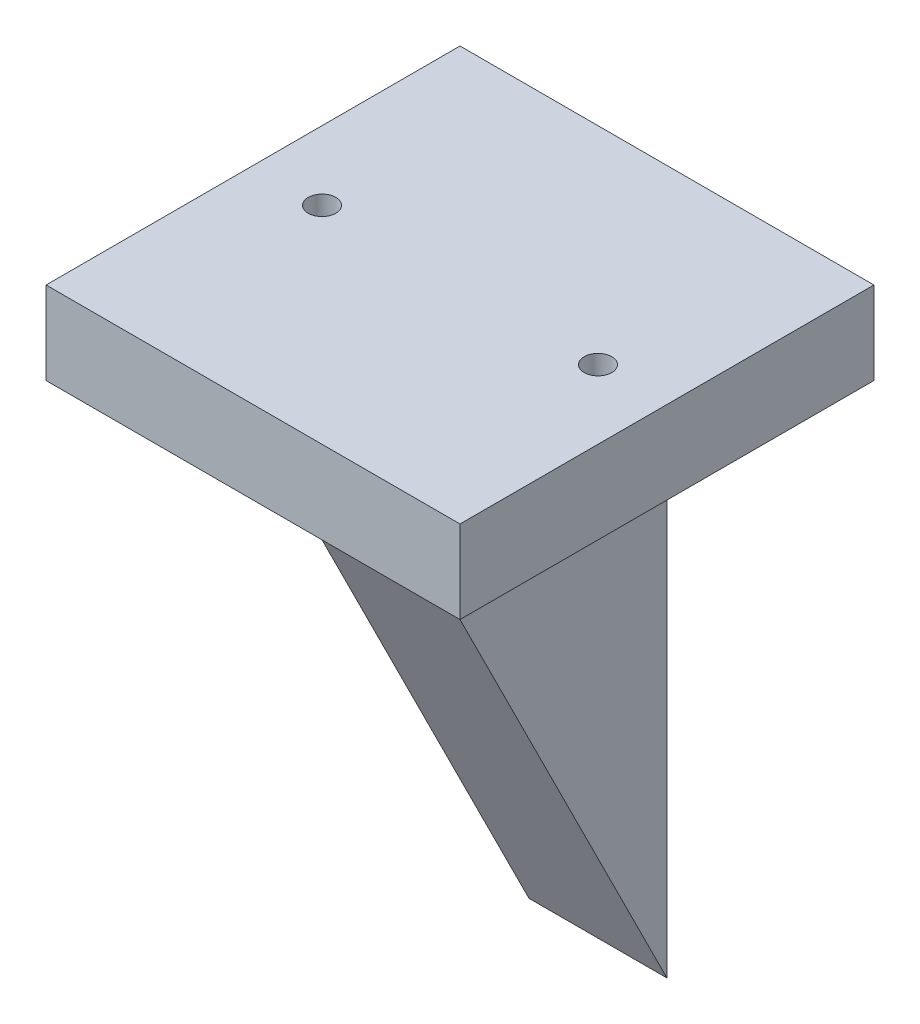
ISO-10303-21;
HEADER;
FILE_DESCRIPTION(('STEP AP214'),'2;1');
FILE_NAME('part.step','',(''),(''),'','','');
FILE_SCHEMA(('AUTOMOTIVE_DESIGN { 1 0 10303 214 1 1 1 1 }'));
ENDSEC;
DATA;
#1=APPLICATION_CONTEXT('core data for automotive mechanical design processes');
#2=APPLICATION_PROTOCOL_DEFINITION('international standard','automotive_design',2000,#1);
#3=PRODUCT_CONTEXT('',#1,'mechanical');
#4=PRODUCT('Part','Part','',(#3));
#5=PRODUCT_RELATED_PRODUCT_CATEGORY('part','',(#4));
#6=PRODUCT_DEFINITION_FORMATION('','',#4);
#7=PRODUCT_DEFINITION_CONTEXT('part definition',#1,'design');
#8=PRODUCT_DEFINITION('design','',#6,#7);
#9=PRODUCT_DEFINITION_SHAPE('','',#8);
#10=(LENGTH_UNIT() NAMED_UNIT(*) SI_UNIT(.MILLI.,.METRE.));
#11=(NAMED_UNIT(*) PLANE_ANGLE_UNIT() SI_UNIT($,.RADIAN.));
#12=(NAMED_UNIT(*) SI_UNIT($,.STERADIAN.) SOLID_ANGLE_UNIT());
#13=UNCERTAINTY_MEASURE_WITH_UNIT(LENGTH_MEASURE(1.E-05),#10,'distance_accuracy_value','');
#14=(GEOMETRIC_REPRESENTATION_CONTEXT(3) GLOBAL_UNCERTAINTY_ASSIGNED_CONTEXT((#13)) GLOBAL_UNIT_ASSIGNED_CONTEXT((#10,
#11,#12)) REPRESENTATION_CONTEXT('',''));
#15=CARTESIAN_POINT('',(0.,0.,0.));
#16=DIRECTION('',(0.,0.,1.));
#17=DIRECTION('',(1.,0.,0.));
#18=AXIS2_PLACEMENT_3D('',#15,#16,#17);
#19=CARTESIAN_POINT('',(5.,0.,0.));
#20=DIRECTION('',(0.,0.,1.));
#21=DIRECTION('',(1.,0.,0.));
#22=AXIS2_PLACEMENT_3D('',#19,#20,#21);
#23=PLANE('',#22);
#24=DIRECTION('',(0.,1.,0.));
#25=VECTOR('',#24,1.);
#26=CARTESIAN_POINT('',(0.,0.,0.));
#27=LINE('',#26,#25);
#28=CARTESIAN_POINT('',(0.,0.,0.));
#29=VERTEX_POINT('',#28);
#30=CARTESIAN_POINT('',(0.,20.,0.));
#31=VERTEX_POINT('',#30);
#32=EDGE_CURVE('E69',#29,#31,#27,.T.);
#33=ORIENTED_EDGE('',*,*,#32,.T.);
#34=DIRECTION('',(-1.,0.,0.));
#35=VECTOR('',#34,1.);
#36=CARTESIAN_POINT('',(5.,20.,0.));
#37=LINE('',#36,#35);
#38=CARTESIAN_POINT('',(5.,20.,0.));
#39=VERTEX_POINT('',#38);
#40=EDGE_CURVE('E11',#39,#31,#37,.T.);
#41=ORIENTED_EDGE('',*,*,#40,.F.);
#42=DIRECTION('',(0.,1.,0.));
#43=VECTOR('',#42,1.);
#44=CARTESIAN_POINT('',(5.,0.,0.));
#45=LINE('',#44,#43);
#46=CARTESIAN_POINT('',(5.,0.,0.));
#47=VERTEX_POINT('',#46);
#48=EDGE_CURVE('E78',#47,#39,#45,.T.);
#49=ORIENTED_EDGE('',*,*,#48,.F.);
#50=DIRECTION('',(-1.,0.,0.));
#51=VECTOR('',#50,1.);
#52=CARTESIAN_POINT('',(5.,0.,0.));
#53=LINE('',#52,#51);
#54=EDGE_CURVE('E89',#47,#29,#53,.T.);
#55=ORIENTED_EDGE('',*,*,#54,.T.);
#56=EDGE_LOOP('',(#33,#41,#49,#55));
#57=FACE_BOUND('',#56,.T.);
#58=ADVANCED_FACE('F34',(#57),#23,.F.);
#59=CARTESIAN_POINT('',(5.,20.,10.));
#60=DIRECTION('',(0.,0.447213595499958,-0.894427190999916));
#61=DIRECTION('',(0.,0.894427190999916,0.447213595499958));
#62=AXIS2_PLACEMENT_3D('',#59,#60,#61);
#63=PLANE('',#62);
#64=DIRECTION('',(0.,-0.894427190999916,-0.447213595499958));
#65=VECTOR('',#64,1.);
#66=CARTESIAN_POINT('',(0.,20.,10.));
#67=LINE('',#66,#65);
#68=CARTESIAN_POINT('',(0.,20.,10.));
#69=VERTEX_POINT('',#68);
#70=EDGE_CURVE('E82',#69,#29,#67,.T.);
#71=ORIENTED_EDGE('',*,*,#70,.T.);
#72=ORIENTED_EDGE('',*,*,#54,.F.);
#73=DIRECTION('',(0.,-0.894427190999916,-0.447213595499958));
#74=VECTOR('',#73,1.);
#75=CARTESIAN_POINT('',(5.,20.,10.));
#76=LINE('',#75,#74);
#77=CARTESIAN_POINT('',(5.,20.,10.));
#78=VERTEX_POINT('',#77);
#79=EDGE_CURVE('E50',#78,#47,#76,.T.);
#80=ORIENTED_EDGE('',*,*,#79,.F.);
#81=DIRECTION('',(-1.,0.,0.));
#82=VECTOR('',#81,1.);
#83=CARTESIAN_POINT('',(5.,20.,10.));
#84=LINE('',#83,#82);
#85=EDGE_CURVE('E42',#78,#69,#84,.T.);
#86=ORIENTED_EDGE('',*,*,#85,.T.);
#87=EDGE_LOOP('',(#71,#72,#80,#86));
#88=FACE_BOUND('',#87,.T.);
#89=ADVANCED_FACE('F100',(#88),#63,.F.);
#90=CARTESIAN_POINT('',(5.,0.,0.));
#91=DIRECTION('',(1.,0.,0.));
#92=DIRECTION('',(0.,0.,-1.));
#93=AXIS2_PLACEMENT_3D('',#90,#91,#92);
#94=PLANE('',#93);
#95=ORIENTED_EDGE('',*,*,#48,.T.);
#96=DIRECTION('',(0.,0.,1.));
#97=VECTOR('',#96,1.);
#98=CARTESIAN_POINT('',(5.,20.,0.));
#99=LINE('',#98,#97);
#100=EDGE_CURVE('E81',#39,#78,#99,.T.);
#101=ORIENTED_EDGE('',*,*,#100,.T.);
#102=ORIENTED_EDGE('',*,*,#79,.T.);
#103=EDGE_LOOP('',(#95,#101,#102));
#104=FACE_BOUND('',#103,.T.);
#105=ADVANCED_FACE('F79',(#104),#94,.T.);
#106=CARTESIAN_POINT('',(0.,0.,0.));
#107=DIRECTION('',(1.,0.,0.));
#108=DIRECTION('',(0.,0.,-1.));
#109=AXIS2_PLACEMENT_3D('',#106,#107,#108);
#110=PLANE('',#109);
#111=ORIENTED_EDGE('',*,*,#32,.F.);
#112=ORIENTED_EDGE('',*,*,#70,.F.);
#113=DIRECTION('',(0.,0.,1.));
#114=VECTOR('',#113,1.);
#115=CARTESIAN_POINT('',(0.,20.,0.));
#116=LINE('',#115,#114);
#117=EDGE_CURVE('E94',#31,#69,#116,.T.);
#118=ORIENTED_EDGE('',*,*,#117,.F.);
#119=EDGE_LOOP('',(#111,#112,#118));
#120=FACE_BOUND('',#119,.T.);
#121=ADVANCED_FACE('F99',(#120),#110,.F.);
#122=CARTESIAN_POINT('',(0.,23.,0.));
#123=DIRECTION('',(0.,-1.,0.));
#124=DIRECTION('',(0.,0.,-1.));
#125=AXIS2_PLACEMENT_3D('',#122,#123,#124);
#126=PLANE('',#125);
#127=DIRECTION('',(0.,0.,-1.));
#128=VECTOR('',#127,1.);
#129=CARTESIAN_POINT('',(10.,23.,12.5));
#130=LINE('',#129,#128);
#131=CARTESIAN_POINT('',(10.,23.,12.5));
#132=VERTEX_POINT('',#131);
#133=CARTESIAN_POINT('',(10.,23.,-2.5));
#134=VERTEX_POINT('',#133);
#135=EDGE_CURVE('E159',#132,#134,#130,.T.);
#136=ORIENTED_EDGE('',*,*,#135,.T.);
#137=DIRECTION('',(-1.,0.,0.));
#138=VECTOR('',#137,1.);
#139=CARTESIAN_POINT('',(-5.,23.,-2.5));
#140=LINE('',#139,#138);
#141=CARTESIAN_POINT('',(-5.,23.,-2.5));
#142=VERTEX_POINT('',#141);
#143=EDGE_CURVE('E162',#134,#142,#140,.T.);
#144=ORIENTED_EDGE('',*,*,#143,.T.);
#145=DIRECTION('',(0.,0.,1.));
#146=VECTOR('',#145,1.);
#147=CARTESIAN_POINT('',(-5.,23.,12.5));
#148=LINE('',#147,#146);
#149=CARTESIAN_POINT('',(-5.,23.,12.5));
#150=VERTEX_POINT('',#149);
#151=EDGE_CURVE('E166',#142,#150,#148,.T.);
#152=ORIENTED_EDGE('',*,*,#151,.T.);
#153=DIRECTION('',(1.,0.,0.));
#154=VECTOR('',#153,1.);
#155=CARTESIAN_POINT('',(-5.,23.,12.5));
#156=LINE('',#155,#154);
#157=EDGE_CURVE('E169',#150,#132,#156,.T.);
#158=ORIENTED_EDGE('',*,*,#157,.T.);
#159=EDGE_LOOP('',(#136,#144,#152,#158));
#160=FACE_BOUND('',#159,.T.);
#161=CARTESIAN_POINT('',(-2.5,23.,5.));
#162=DIRECTION('',(0.,1.,0.));
#163=DIRECTION('',(0.,0.,1.));
#164=AXIS2_PLACEMENT_3D('',#161,#162,#163);
#165=CIRCLE('',#164,0.5);
#166=CARTESIAN_POINT('',(-2.5,23.,5.5));
#167=VERTEX_POINT('',#166);
#168=EDGE_CURVE('E153',#167,#167,#165,.T.);
#169=ORIENTED_EDGE('',*,*,#168,.F.);
#170=EDGE_LOOP('',(#169));
#171=FACE_BOUND('',#170,.T.);
#172=CARTESIAN_POINT('',(7.5,23.,5.));
#173=DIRECTION('',(0.,1.,0.));
#174=DIRECTION('',(0.,0.,1.));
#175=AXIS2_PLACEMENT_3D('',#172,#173,#174);
#176=CIRCLE('',#175,0.5);
#177=CARTESIAN_POINT('',(7.5,23.,5.5));
#178=VERTEX_POINT('',#177);
#179=EDGE_CURVE('E144',#178,#178,#176,.T.);
#180=ORIENTED_EDGE('',*,*,#179,.F.);
#181=EDGE_LOOP('',(#180));
#182=FACE_BOUND('',#181,.T.);
#183=ADVANCED_FACE('F109',(#160,#171,#182),#126,.F.);
#184=CARTESIAN_POINT('',(0.,20.,0.));
#185=DIRECTION('',(0.,-1.,0.));
#186=DIRECTION('',(0.,0.,-1.));
#187=AXIS2_PLACEMENT_3D('',#184,#185,#186);
#188=PLANE('',#187);
#189=ORIENTED_EDGE('',*,*,#40,.T.);
#190=ORIENTED_EDGE('',*,*,#117,.T.);
#191=ORIENTED_EDGE('',*,*,#85,.F.);
#192=ORIENTED_EDGE('',*,*,#100,.F.);
#193=EDGE_LOOP('',(#189,#190,#191,#192));
#194=FACE_BOUND('',#193,.T.);
#195=CARTESIAN_POINT('',(-2.5,20.,5.));
#196=DIRECTION('',(0.,1.,0.));
#197=DIRECTION('',(0.,0.,1.));
#198=AXIS2_PLACEMENT_3D('',#195,#196,#197);
#199=CIRCLE('',#198,0.5);
#200=CARTESIAN_POINT('',(-2.5,20.,5.5));
#201=VERTEX_POINT('',#200);
#202=EDGE_CURVE('E150',#201,#201,#199,.T.);
#203=ORIENTED_EDGE('',*,*,#202,.T.);
#204=EDGE_LOOP('',(#203));
#205=FACE_BOUND('',#204,.T.);
#206=DIRECTION('',(0.,0.,-1.));
#207=VECTOR('',#206,1.);
#208=CARTESIAN_POINT('',(10.,20.,12.5));
#209=LINE('',#208,#207);
#210=CARTESIAN_POINT('',(10.,20.,12.5));
#211=VERTEX_POINT('',#210);
#212=CARTESIAN_POINT('',(10.,20.,-2.5));
#213=VERTEX_POINT('',#212);
#214=EDGE_CURVE('E156',#211,#213,#209,.T.);
#215=ORIENTED_EDGE('',*,*,#214,.F.);
#216=DIRECTION('',(1.,0.,0.));
#217=VECTOR('',#216,1.);
#218=CARTESIAN_POINT('',(-5.,20.,12.5));
#219=LINE('',#218,#217);
#220=CARTESIAN_POINT('',(-5.,20.,12.5));
#221=VERTEX_POINT('',#220);
#222=EDGE_CURVE('E163',#221,#211,#219,.T.);
#223=ORIENTED_EDGE('',*,*,#222,.F.);
#224=DIRECTION('',(0.,0.,1.));
#225=VECTOR('',#224,1.);
#226=CARTESIAN_POINT('',(-5.,20.,12.5));
#227=LINE('',#226,#225);
#228=CARTESIAN_POINT('',(-5.,20.,-2.5));
#229=VERTEX_POINT('',#228);
#230=EDGE_CURVE('E177',#229,#221,#227,.T.);
#231=ORIENTED_EDGE('',*,*,#230,.F.);
#232=DIRECTION('',(-1.,0.,0.));
#233=VECTOR('',#232,1.);
#234=CARTESIAN_POINT('',(-5.,20.,-2.5));
#235=LINE('',#234,#233);
#236=EDGE_CURVE('E174',#213,#229,#235,.T.);
#237=ORIENTED_EDGE('',*,*,#236,.F.);
#238=EDGE_LOOP('',(#215,#223,#231,#237));
#239=FACE_BOUND('',#238,.T.);
#240=CARTESIAN_POINT('',(7.5,20.,5.));
#241=DIRECTION('',(0.,1.,0.));
#242=DIRECTION('',(0.,0.,1.));
#243=AXIS2_PLACEMENT_3D('',#240,#241,#242);
#244=CIRCLE('',#243,0.5);
#245=CARTESIAN_POINT('',(7.5,20.,5.5));
#246=VERTEX_POINT('',#245);
#247=EDGE_CURVE('E147',#246,#246,#244,.T.);
#248=ORIENTED_EDGE('',*,*,#247,.T.);
#249=EDGE_LOOP('',(#248));
#250=FACE_BOUND('',#249,.T.);
#251=ADVANCED_FACE('F86',(#194,#205,#239,#250),#188,.T.);
#252=CARTESIAN_POINT('',(10.,23.,12.5));
#253=DIRECTION('',(-1.,0.,0.));
#254=DIRECTION('',(0.,0.,1.));
#255=AXIS2_PLACEMENT_3D('',#252,#253,#254);
#256=PLANE('',#255);
#257=ORIENTED_EDGE('',*,*,#214,.T.);
#258=DIRECTION('',(0.,-1.,0.));
#259=VECTOR('',#258,1.);
#260=CARTESIAN_POINT('',(10.,23.,-2.5));
#261=LINE('',#260,#259);
#262=EDGE_CURVE('E95',#134,#213,#261,.T.);
#263=ORIENTED_EDGE('',*,*,#262,.F.);
#264=ORIENTED_EDGE('',*,*,#135,.F.);
#265=DIRECTION('',(0.,-1.,0.));
#266=VECTOR('',#265,1.);
#267=CARTESIAN_POINT('',(10.,23.,12.5));
#268=LINE('',#267,#266);
#269=EDGE_CURVE('E171',#132,#211,#268,.T.);
#270=ORIENTED_EDGE('',*,*,#269,.T.);
#271=EDGE_LOOP('',(#257,#263,#264,#270));
#272=FACE_BOUND('',#271,.T.);
#273=ADVANCED_FACE('F111',(#272),#256,.F.);
#274=CARTESIAN_POINT('',(-5.,23.,-2.5));
#275=DIRECTION('',(0.,0.,1.));
#276=DIRECTION('',(1.,0.,0.));
#277=AXIS2_PLACEMENT_3D('',#274,#275,#276);
#278=PLANE('',#277);
#279=ORIENTED_EDGE('',*,*,#236,.T.);
#280=DIRECTION('',(0.,-1.,0.));
#281=VECTOR('',#280,1.);
#282=CARTESIAN_POINT('',(-5.,23.,-2.5));
#283=LINE('',#282,#281);
#284=EDGE_CURVE('E187',#142,#229,#283,.T.);
#285=ORIENTED_EDGE('',*,*,#284,.F.);
#286=ORIENTED_EDGE('',*,*,#143,.F.);
#287=ORIENTED_EDGE('',*,*,#262,.T.);
#288=EDGE_LOOP('',(#279,#285,#286,#287));
#289=FACE_BOUND('',#288,.T.);
#290=ADVANCED_FACE('F114',(#289),#278,.F.);
#291=CARTESIAN_POINT('',(-5.,23.,12.5));
#292=DIRECTION('',(1.,0.,0.));
#293=DIRECTION('',(0.,0.,-1.));
#294=AXIS2_PLACEMENT_3D('',#291,#292,#293);
#295=PLANE('',#294);
#296=ORIENTED_EDGE('',*,*,#230,.T.);
#297=DIRECTION('',(0.,-1.,0.));
#298=VECTOR('',#297,1.);
#299=CARTESIAN_POINT('',(-5.,23.,12.5));
#300=LINE('',#299,#298);
#301=EDGE_CURVE('E184',#150,#221,#300,.T.);
#302=ORIENTED_EDGE('',*,*,#301,.F.);
#303=ORIENTED_EDGE('',*,*,#151,.F.);
#304=ORIENTED_EDGE('',*,*,#284,.T.);
#305=EDGE_LOOP('',(#296,#302,#303,#304));
#306=FACE_BOUND('',#305,.T.);
#307=ADVANCED_FACE('F118',(#306),#295,.F.);
#308=CARTESIAN_POINT('',(-5.,23.,12.5));
#309=DIRECTION('',(0.,0.,-1.));
#310=DIRECTION('',(-1.,0.,0.));
#311=AXIS2_PLACEMENT_3D('',#308,#309,#310);
#312=PLANE('',#311);
#313=ORIENTED_EDGE('',*,*,#222,.T.);
#314=ORIENTED_EDGE('',*,*,#269,.F.);
#315=ORIENTED_EDGE('',*,*,#157,.F.);
#316=ORIENTED_EDGE('',*,*,#301,.T.);
#317=EDGE_LOOP('',(#313,#314,#315,#316));
#318=FACE_BOUND('',#317,.T.);
#319=ADVANCED_FACE('F122',(#318),#312,.F.);
#320=CARTESIAN_POINT('',(-2.5,23.,5.));
#321=DIRECTION('',(0.,-1.,0.));
#322=DIRECTION('',(0.,0.,-1.));
#323=AXIS2_PLACEMENT_3D('',#320,#321,#322);
#324=CYLINDRICAL_SURFACE('',#323,0.5);
#325=ORIENTED_EDGE('',*,*,#168,.T.);
#326=EDGE_LOOP('',(#325));
#327=FACE_BOUND('',#326,.T.);
#328=ORIENTED_EDGE('',*,*,#202,.F.);
#329=EDGE_LOOP('',(#328));
#330=FACE_BOUND('',#329,.T.);
#331=ADVANCED_FACE('F126',(#327,#330),#324,.F.);
#332=CARTESIAN_POINT('',(7.5,23.,5.));
#333=DIRECTION('',(0.,-1.,0.));
#334=DIRECTION('',(0.,0.,-1.));
#335=AXIS2_PLACEMENT_3D('',#332,#333,#334);
#336=CYLINDRICAL_SURFACE('',#335,0.5);
#337=ORIENTED_EDGE('',*,*,#179,.T.);
#338=EDGE_LOOP('',(#337));
#339=FACE_BOUND('',#338,.T.);
#340=ORIENTED_EDGE('',*,*,#247,.F.);
#341=EDGE_LOOP('',(#340));
#342=FACE_BOUND('',#341,.T.);
#343=ADVANCED_FACE('F135',(#339,#342),#336,.F.);
#344=CLOSED_SHELL('',(#58,#89,#105,#121,#183,#251,#273,#290,#307,#319,#331,#343));
#345=MANIFOLD_SOLID_BREP('B2',#344);
#346=ADVANCED_BREP_SHAPE_REPRESENTATION('',(#18,#345),#14);
#347=SHAPE_DEFINITION_REPRESENTATION(#9,#346);
ENDSEC;
END-ISO-10303-21;
